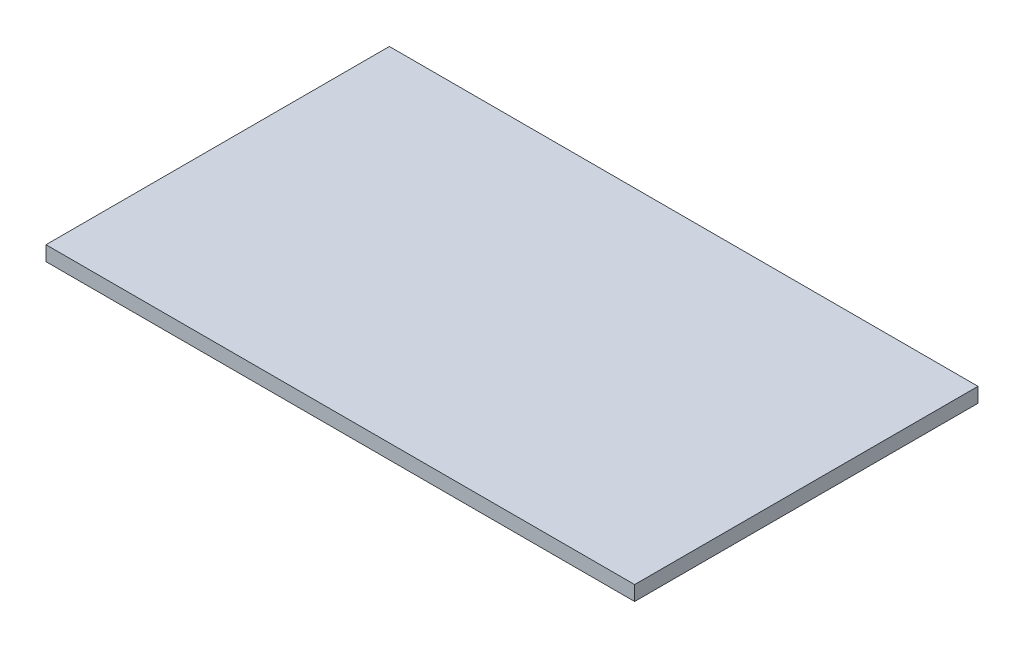
ISO-10303-21;
HEADER;
FILE_DESCRIPTION(('STEP AP214'),'2;1');
FILE_NAME('part.step','',(''),(''),'','','');
FILE_SCHEMA(('AUTOMOTIVE_DESIGN { 1 0 10303 214 1 1 1 1 }'));
ENDSEC;
DATA;
#1=APPLICATION_CONTEXT('core data for automotive mechanical design processes');
#2=APPLICATION_PROTOCOL_DEFINITION('international standard','automotive_design',2000,#1);
#3=PRODUCT_CONTEXT('',#1,'mechanical');
#4=PRODUCT('Part','Part','',(#3));
#5=PRODUCT_RELATED_PRODUCT_CATEGORY('part','',(#4));
#6=PRODUCT_DEFINITION_FORMATION('','',#4);
#7=PRODUCT_DEFINITION_CONTEXT('part definition',#1,'design');
#8=PRODUCT_DEFINITION('design','',#6,#7);
#9=PRODUCT_DEFINITION_SHAPE('','',#8);
#10=(LENGTH_UNIT() NAMED_UNIT(*) SI_UNIT(.MILLI.,.METRE.));
#11=(NAMED_UNIT(*) PLANE_ANGLE_UNIT() SI_UNIT($,.RADIAN.));
#12=(NAMED_UNIT(*) SI_UNIT($,.STERADIAN.) SOLID_ANGLE_UNIT());
#13=UNCERTAINTY_MEASURE_WITH_UNIT(LENGTH_MEASURE(1.E-05),#10,'distance_accuracy_value','');
#14=(GEOMETRIC_REPRESENTATION_CONTEXT(3) GLOBAL_UNCERTAINTY_ASSIGNED_CONTEXT((#13)) GLOBAL_UNIT_ASSIGNED_CONTEXT((#10,
#11,#12)) REPRESENTATION_CONTEXT('',''));
#15=CARTESIAN_POINT('',(0.,0.,0.));
#16=DIRECTION('',(0.,0.,1.));
#17=DIRECTION('',(1.,0.,0.));
#18=AXIS2_PLACEMENT_3D('',#15,#16,#17);
#19=CARTESIAN_POINT('',(30.,1.5,-17.5));
#20=DIRECTION('',(-1.,0.,0.));
#21=DIRECTION('',(0.,0.,1.));
#22=AXIS2_PLACEMENT_3D('',#19,#20,#21);
#23=PLANE('',#22);
#24=DIRECTION('',(0.,0.,-1.));
#25=VECTOR('',#24,1.);
#26=CARTESIAN_POINT('',(30.,0.,-17.5));
#27=LINE('',#26,#25);
#28=CARTESIAN_POINT('',(30.,0.,17.5));
#29=VERTEX_POINT('',#28);
#30=CARTESIAN_POINT('',(30.,0.,-17.5));
#31=VERTEX_POINT('',#30);
#32=EDGE_CURVE('E98',#29,#31,#27,.T.);
#33=ORIENTED_EDGE('',*,*,#32,.T.);
#34=DIRECTION('',(0.,-1.,0.));
#35=VECTOR('',#34,1.);
#36=CARTESIAN_POINT('',(30.,1.5,-17.5));
#37=LINE('',#36,#35);
#38=CARTESIAN_POINT('',(30.,1.5,-17.5));
#39=VERTEX_POINT('',#38);
#40=EDGE_CURVE('E11',#39,#31,#37,.T.);
#41=ORIENTED_EDGE('',*,*,#40,.F.);
#42=DIRECTION('',(0.,0.,-1.));
#43=VECTOR('',#42,1.);
#44=CARTESIAN_POINT('',(30.,1.5,-17.5));
#45=LINE('',#44,#43);
#46=CARTESIAN_POINT('',(30.,1.5,17.5));
#47=VERTEX_POINT('',#46);
#48=EDGE_CURVE('E86',#47,#39,#45,.T.);
#49=ORIENTED_EDGE('',*,*,#48,.F.);
#50=DIRECTION('',(0.,-1.,0.));
#51=VECTOR('',#50,1.);
#52=CARTESIAN_POINT('',(30.,1.5,17.5));
#53=LINE('',#52,#51);
#54=EDGE_CURVE('E94',#47,#29,#53,.T.);
#55=ORIENTED_EDGE('',*,*,#54,.T.);
#56=EDGE_LOOP('',(#33,#41,#49,#55));
#57=FACE_BOUND('',#56,.T.);
#58=ADVANCED_FACE('F35',(#57),#23,.F.);
#59=CARTESIAN_POINT('',(-30.,1.5,-17.5));
#60=DIRECTION('',(0.,0.,1.));
#61=DIRECTION('',(1.,0.,0.));
#62=AXIS2_PLACEMENT_3D('',#59,#60,#61);
#63=PLANE('',#62);
#64=DIRECTION('',(-1.,0.,0.));
#65=VECTOR('',#64,1.);
#66=CARTESIAN_POINT('',(-30.,0.,-17.5));
#67=LINE('',#66,#65);
#68=CARTESIAN_POINT('',(-30.,0.,-17.5));
#69=VERTEX_POINT('',#68);
#70=EDGE_CURVE('E90',#31,#69,#67,.T.);
#71=ORIENTED_EDGE('',*,*,#70,.T.);
#72=DIRECTION('',(0.,-1.,0.));
#73=VECTOR('',#72,1.);
#74=CARTESIAN_POINT('',(-30.,1.5,-17.5));
#75=LINE('',#74,#73);
#76=CARTESIAN_POINT('',(-30.,1.5,-17.5));
#77=VERTEX_POINT('',#76);
#78=EDGE_CURVE('E43',#77,#69,#75,.T.);
#79=ORIENTED_EDGE('',*,*,#78,.F.);
#80=DIRECTION('',(-1.,0.,0.));
#81=VECTOR('',#80,1.);
#82=CARTESIAN_POINT('',(-30.,1.5,-17.5));
#83=LINE('',#82,#81);
#84=EDGE_CURVE('E81',#39,#77,#83,.T.);
#85=ORIENTED_EDGE('',*,*,#84,.F.);
#86=ORIENTED_EDGE('',*,*,#40,.T.);
#87=EDGE_LOOP('',(#71,#79,#85,#86));
#88=FACE_BOUND('',#87,.T.);
#89=ADVANCED_FACE('F89',(#88),#63,.F.);
#90=CARTESIAN_POINT('',(-30.,1.5,-17.5));
#91=DIRECTION('',(1.,0.,0.));
#92=DIRECTION('',(0.,0.,-1.));
#93=AXIS2_PLACEMENT_3D('',#90,#91,#92);
#94=PLANE('',#93);
#95=DIRECTION('',(0.,0.,1.));
#96=VECTOR('',#95,1.);
#97=CARTESIAN_POINT('',(-30.,0.,-17.5));
#98=LINE('',#97,#96);
#99=CARTESIAN_POINT('',(-30.,0.,17.5));
#100=VERTEX_POINT('',#99);
#101=EDGE_CURVE('E68',#69,#100,#98,.T.);
#102=ORIENTED_EDGE('',*,*,#101,.T.);
#103=DIRECTION('',(0.,-1.,0.));
#104=VECTOR('',#103,1.);
#105=CARTESIAN_POINT('',(-30.,1.5,17.5));
#106=LINE('',#105,#104);
#107=CARTESIAN_POINT('',(-30.,1.5,17.5));
#108=VERTEX_POINT('',#107);
#109=EDGE_CURVE('E91',#108,#100,#106,.T.);
#110=ORIENTED_EDGE('',*,*,#109,.F.);
#111=DIRECTION('',(0.,0.,1.));
#112=VECTOR('',#111,1.);
#113=CARTESIAN_POINT('',(-30.,1.5,-17.5));
#114=LINE('',#113,#112);
#115=EDGE_CURVE('E84',#77,#108,#114,.T.);
#116=ORIENTED_EDGE('',*,*,#115,.F.);
#117=ORIENTED_EDGE('',*,*,#78,.T.);
#118=EDGE_LOOP('',(#102,#110,#116,#117));
#119=FACE_BOUND('',#118,.T.);
#120=ADVANCED_FACE('F92',(#119),#94,.F.);
#121=CARTESIAN_POINT('',(-30.,1.5,17.5));
#122=DIRECTION('',(0.,0.,-1.));
#123=DIRECTION('',(-1.,0.,0.));
#124=AXIS2_PLACEMENT_3D('',#121,#122,#123);
#125=PLANE('',#124);
#126=DIRECTION('',(1.,0.,0.));
#127=VECTOR('',#126,1.);
#128=CARTESIAN_POINT('',(-30.,0.,17.5));
#129=LINE('',#128,#127);
#130=EDGE_CURVE('E74',#100,#29,#129,.T.);
#131=ORIENTED_EDGE('',*,*,#130,.T.);
#132=ORIENTED_EDGE('',*,*,#54,.F.);
#133=DIRECTION('',(1.,0.,0.));
#134=VECTOR('',#133,1.);
#135=CARTESIAN_POINT('',(-30.,1.5,17.5));
#136=LINE('',#135,#134);
#137=EDGE_CURVE('E51',#108,#47,#136,.T.);
#138=ORIENTED_EDGE('',*,*,#137,.F.);
#139=ORIENTED_EDGE('',*,*,#109,.T.);
#140=EDGE_LOOP('',(#131,#132,#138,#139));
#141=FACE_BOUND('',#140,.T.);
#142=ADVANCED_FACE('F105',(#141),#125,.F.);
#143=CARTESIAN_POINT('',(0.,1.5,0.));
#144=DIRECTION('',(0.,1.,0.));
#145=DIRECTION('',(0.,0.,1.));
#146=AXIS2_PLACEMENT_3D('',#143,#144,#145);
#147=PLANE('',#146);
#148=ORIENTED_EDGE('',*,*,#48,.T.);
#149=ORIENTED_EDGE('',*,*,#84,.T.);
#150=ORIENTED_EDGE('',*,*,#115,.T.);
#151=ORIENTED_EDGE('',*,*,#137,.T.);
#152=EDGE_LOOP('',(#148,#149,#150,#151));
#153=FACE_BOUND('',#152,.T.);
#154=ADVANCED_FACE('F82',(#153),#147,.T.);
#155=CARTESIAN_POINT('',(0.,0.,0.));
#156=DIRECTION('',(0.,1.,0.));
#157=DIRECTION('',(0.,0.,1.));
#158=AXIS2_PLACEMENT_3D('',#155,#156,#157);
#159=PLANE('',#158);
#160=ORIENTED_EDGE('',*,*,#32,.F.);
#161=ORIENTED_EDGE('',*,*,#130,.F.);
#162=ORIENTED_EDGE('',*,*,#101,.F.);
#163=ORIENTED_EDGE('',*,*,#70,.F.);
#164=EDGE_LOOP('',(#160,#161,#162,#163));
#165=FACE_BOUND('',#164,.T.);
#166=ADVANCED_FACE('F108',(#165),#159,.F.);
#167=CLOSED_SHELL('',(#58,#89,#120,#142,#154,#166));
#168=MANIFOLD_SOLID_BREP('B2',#167);
#169=ADVANCED_BREP_SHAPE_REPRESENTATION('',(#18,#168),#14);
#170=SHAPE_DEFINITION_REPRESENTATION(#9,#169);
ENDSEC;
END-ISO-10303-21;
